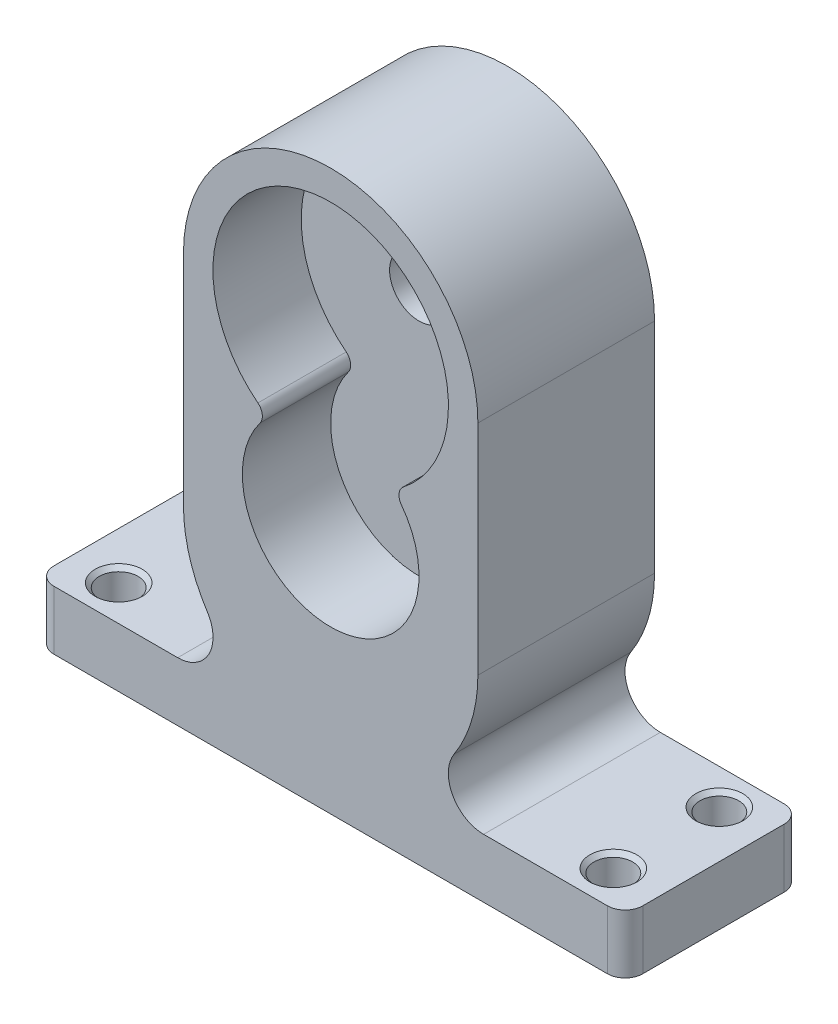
ISO-10303-21;
HEADER;
FILE_DESCRIPTION(('STEP AP214'),'2;1');
FILE_NAME('part.step','',(''),(''),'','','');
FILE_SCHEMA(('AUTOMOTIVE_DESIGN { 1 0 10303 214 1 1 1 1 }'));
ENDSEC;
DATA;
#1=APPLICATION_CONTEXT('core data for automotive mechanical design processes');
#2=APPLICATION_PROTOCOL_DEFINITION('international standard','automotive_design',2000,#1);
#3=PRODUCT_CONTEXT('',#1,'mechanical');
#4=PRODUCT('Part','Part','',(#3));
#5=PRODUCT_RELATED_PRODUCT_CATEGORY('part','',(#4));
#6=PRODUCT_DEFINITION_FORMATION('','',#4);
#7=PRODUCT_DEFINITION_CONTEXT('part definition',#1,'design');
#8=PRODUCT_DEFINITION('design','',#6,#7);
#9=PRODUCT_DEFINITION_SHAPE('','',#8);
#10=(LENGTH_UNIT() NAMED_UNIT(*) SI_UNIT(.MILLI.,.METRE.));
#11=(NAMED_UNIT(*) PLANE_ANGLE_UNIT() SI_UNIT($,.RADIAN.));
#12=(NAMED_UNIT(*) SI_UNIT($,.STERADIAN.) SOLID_ANGLE_UNIT());
#13=UNCERTAINTY_MEASURE_WITH_UNIT(LENGTH_MEASURE(1.E-05),#10,'distance_accuracy_value','');
#14=(GEOMETRIC_REPRESENTATION_CONTEXT(3) GLOBAL_UNCERTAINTY_ASSIGNED_CONTEXT((#13)) GLOBAL_UNIT_ASSIGNED_CONTEXT((#10,
#11,#12)) REPRESENTATION_CONTEXT('',''));
#15=CARTESIAN_POINT('',(0.,0.,0.));
#16=DIRECTION('',(0.,0.,1.));
#17=DIRECTION('',(1.,0.,0.));
#18=AXIS2_PLACEMENT_3D('',#15,#16,#17);
#19=CARTESIAN_POINT('',(0.,70.0001523668268,-30.));
#20=DIRECTION('',(0.,0.,1.));
#21=DIRECTION('',(1.,0.,0.));
#22=AXIS2_PLACEMENT_3D('',#19,#20,#21);
#23=CYLINDRICAL_SURFACE('',#22,25.);
#24=CARTESIAN_POINT('',(0.,70.0001523668268,0.));
#25=DIRECTION('',(0.,0.,1.));
#26=DIRECTION('',(-1.,0.,0.));
#27=AXIS2_PLACEMENT_3D('',#24,#25,#26);
#28=CIRCLE('',#27,25.);
#29=CARTESIAN_POINT('',(25.,70.0001523668268,0.));
#30=VERTEX_POINT('',#29);
#31=CARTESIAN_POINT('',(-25.,70.0001523668268,0.));
#32=VERTEX_POINT('',#31);
#33=EDGE_CURVE('E212',#30,#32,#28,.T.);
#34=ORIENTED_EDGE('',*,*,#33,.F.);
#35=DIRECTION('',(0.,0.,1.));
#36=VECTOR('',#35,1.);
#37=CARTESIAN_POINT('',(25.,70.0001523668268,-30.));
#38=LINE('',#37,#36);
#39=CARTESIAN_POINT('',(25.,70.0001523668268,-30.));
#40=VERTEX_POINT('',#39);
#41=EDGE_CURVE('E178',#40,#30,#38,.T.);
#42=ORIENTED_EDGE('',*,*,#41,.F.);
#43=CARTESIAN_POINT('',(0.,70.0001523668268,-30.));
#44=DIRECTION('',(0.,0.,1.));
#45=DIRECTION('',(-1.,0.,0.));
#46=AXIS2_PLACEMENT_3D('',#43,#44,#45);
#47=CIRCLE('',#46,25.);
#48=CARTESIAN_POINT('',(-25.,70.0001523668268,-30.));
#49=VERTEX_POINT('',#48);
#50=EDGE_CURVE('E173',#40,#49,#47,.T.);
#51=ORIENTED_EDGE('',*,*,#50,.T.);
#52=DIRECTION('',(0.,0.,1.));
#53=VECTOR('',#52,1.);
#54=CARTESIAN_POINT('',(-25.,70.0001523668268,-30.));
#55=LINE('',#54,#53);
#56=EDGE_CURVE('E177',#49,#32,#55,.T.);
#57=ORIENTED_EDGE('',*,*,#56,.T.);
#58=EDGE_LOOP('',(#34,#42,#51,#57));
#59=FACE_BOUND('',#58,.T.);
#60=ADVANCED_FACE('F37',(#59),#23,.T.);
#61=CARTESIAN_POINT('',(25.,70.0001523668268,-30.));
#62=DIRECTION('',(1.,0.,0.));
#63=DIRECTION('',(0.,1.,0.));
#64=AXIS2_PLACEMENT_3D('',#61,#62,#63);
#65=PLANE('',#64);
#66=DIRECTION('',(0.,1.,0.));
#67=VECTOR('',#66,1.);
#68=CARTESIAN_POINT('',(25.,70.0001523668268,0.));
#69=LINE('',#68,#67);
#70=CARTESIAN_POINT('',(25.,32.9128784747792,0.));
#71=VERTEX_POINT('',#70);
#72=EDGE_CURVE('E225',#71,#30,#69,.T.);
#73=ORIENTED_EDGE('',*,*,#72,.F.);
#74=DIRECTION('',(0.,0.,1.));
#75=VECTOR('',#74,1.);
#76=CARTESIAN_POINT('',(25.,32.9128784747792,-30.));
#77=LINE('',#76,#75);
#78=CARTESIAN_POINT('',(25.,32.9128784747792,-30.));
#79=VERTEX_POINT('',#78);
#80=EDGE_CURVE('E231',#79,#71,#77,.T.);
#81=ORIENTED_EDGE('',*,*,#80,.F.);
#82=DIRECTION('',(0.,1.,0.));
#83=VECTOR('',#82,1.);
#84=CARTESIAN_POINT('',(25.,70.0001523668268,-30.));
#85=LINE('',#84,#83);
#86=EDGE_CURVE('E183',#79,#40,#85,.T.);
#87=ORIENTED_EDGE('',*,*,#86,.T.);
#88=ORIENTED_EDGE('',*,*,#41,.T.);
#89=EDGE_LOOP('',(#73,#81,#87,#88));
#90=FACE_BOUND('',#89,.T.);
#91=ADVANCED_FACE('F424',(#90),#65,.T.);
#92=CARTESIAN_POINT('',(0.,32.9128784747792,-30.));
#93=DIRECTION('',(0.,0.,1.));
#94=DIRECTION('',(1.,0.,0.));
#95=AXIS2_PLACEMENT_3D('',#92,#93,#94);
#96=CYLINDRICAL_SURFACE('',#95,25.);
#97=CARTESIAN_POINT('',(0.,32.9128784747792,0.));
#98=DIRECTION('',(0.,0.,1.));
#99=DIRECTION('',(1.,0.,0.));
#100=AXIS2_PLACEMENT_3D('',#97,#98,#99);
#101=CIRCLE('',#100,25.);
#102=CARTESIAN_POINT('',(20.951521978517,19.2734603499573,0.));
#103=VERTEX_POINT('',#102);
#104=EDGE_CURVE('E223',#103,#71,#101,.T.);
#105=ORIENTED_EDGE('',*,*,#104,.F.);
#106=DIRECTION('',(0.,0.,1.));
#107=VECTOR('',#106,1.);
#108=CARTESIAN_POINT('',(20.9515219785169,19.2734603499573,-30.));
#109=LINE('',#108,#107);
#110=CARTESIAN_POINT('',(20.951521978517,19.2734603499573,-30.));
#111=VERTEX_POINT('',#110);
#112=EDGE_CURVE('E246',#103,#111,#109,.F.);
#113=ORIENTED_EDGE('',*,*,#112,.T.);
#114=CARTESIAN_POINT('',(0.,32.9128784747792,-30.));
#115=DIRECTION('',(0.,0.,1.));
#116=DIRECTION('',(1.,0.,0.));
#117=AXIS2_PLACEMENT_3D('',#114,#115,#116);
#118=CIRCLE('',#117,25.);
#119=EDGE_CURVE('E214',#111,#79,#118,.T.);
#120=ORIENTED_EDGE('',*,*,#119,.T.);
#121=ORIENTED_EDGE('',*,*,#80,.T.);
#122=EDGE_LOOP('',(#105,#113,#120,#121));
#123=FACE_BOUND('',#122,.T.);
#124=ADVANCED_FACE('F429',(#123),#96,.T.);
#125=CARTESIAN_POINT('',(50.,10.,-30.));
#126=DIRECTION('',(0.,1.,0.));
#127=DIRECTION('',(-1.,0.,0.));
#128=AXIS2_PLACEMENT_3D('',#125,#126,#127);
#129=PLANE('',#128);
#130=CARTESIAN_POINT('',(42.,10.,-6.));
#131=DIRECTION('',(0.,1.,0.));
#132=DIRECTION('',(0.,0.,1.));
#133=AXIS2_PLACEMENT_3D('',#130,#131,#132);
#134=CIRCLE('',#133,4.);
#135=CARTESIAN_POINT('',(42.,10.,-2.00000000000001));
#136=VERTEX_POINT('',#135);
#137=EDGE_CURVE('E385',#136,#136,#134,.T.);
#138=ORIENTED_EDGE('',*,*,#137,.F.);
#139=EDGE_LOOP('',(#138));
#140=FACE_BOUND('',#139,.T.);
#141=CARTESIAN_POINT('',(42.,10.,-24.));
#142=DIRECTION('',(0.,1.,0.));
#143=DIRECTION('',(0.,0.,1.));
#144=AXIS2_PLACEMENT_3D('',#141,#142,#143);
#145=CIRCLE('',#144,4.);
#146=CARTESIAN_POINT('',(42.,10.,-20.));
#147=VERTEX_POINT('',#146);
#148=EDGE_CURVE('E367',#147,#147,#145,.T.);
#149=ORIENTED_EDGE('',*,*,#148,.F.);
#150=EDGE_LOOP('',(#149));
#151=FACE_BOUND('',#150,.T.);
#152=DIRECTION('',(0.,0.,1.));
#153=VECTOR('',#152,1.);
#154=CARTESIAN_POINT('',(50.,10.,-30.));
#155=LINE('',#154,#153);
#156=CARTESIAN_POINT('',(50.,10.,-27.));
#157=VERTEX_POINT('',#156);
#158=CARTESIAN_POINT('',(50.,10.,-3.));
#159=VERTEX_POINT('',#158);
#160=EDGE_CURVE('E234',#157,#159,#155,.T.);
#161=ORIENTED_EDGE('',*,*,#160,.F.);
#162=CARTESIAN_POINT('',(47.,10.,-27.));
#163=DIRECTION('',(0.,1.,0.));
#164=DIRECTION('',(-1.,0.,0.));
#165=AXIS2_PLACEMENT_3D('',#162,#163,#164);
#166=CIRCLE('',#165,3.);
#167=CARTESIAN_POINT('',(47.,10.,-30.));
#168=VERTEX_POINT('',#167);
#169=EDGE_CURVE('E11',#157,#168,#166,.T.);
#170=ORIENTED_EDGE('',*,*,#169,.T.);
#171=DIRECTION('',(-1.,0.,0.));
#172=VECTOR('',#171,1.);
#173=CARTESIAN_POINT('',(50.,10.,-30.));
#174=LINE('',#173,#172);
#175=CARTESIAN_POINT('',(25.979887253361,10.,-30.));
#176=VERTEX_POINT('',#175);
#177=EDGE_CURVE('E211',#168,#176,#174,.T.);
#178=ORIENTED_EDGE('',*,*,#177,.T.);
#179=DIRECTION('',(0.,0.,-1.));
#180=VECTOR('',#179,1.);
#181=CARTESIAN_POINT('',(25.979887253361,10.,0.));
#182=LINE('',#181,#180);
#183=CARTESIAN_POINT('',(25.979887253361,10.,0.));
#184=VERTEX_POINT('',#183);
#185=EDGE_CURVE('E243',#176,#184,#182,.F.);
#186=ORIENTED_EDGE('',*,*,#185,.T.);
#187=DIRECTION('',(-1.,0.,0.));
#188=VECTOR('',#187,1.);
#189=CARTESIAN_POINT('',(50.,10.,0.));
#190=LINE('',#189,#188);
#191=CARTESIAN_POINT('',(47.,10.,0.));
#192=VERTEX_POINT('',#191);
#193=EDGE_CURVE('E220',#192,#184,#190,.T.);
#194=ORIENTED_EDGE('',*,*,#193,.F.);
#195=CARTESIAN_POINT('',(47.,10.,-3.));
#196=DIRECTION('',(0.,1.,0.));
#197=DIRECTION('',(-1.,0.,0.));
#198=AXIS2_PLACEMENT_3D('',#195,#196,#197);
#199=CIRCLE('',#198,3.);
#200=EDGE_CURVE('E45',#192,#159,#199,.T.);
#201=ORIENTED_EDGE('',*,*,#200,.T.);
#202=EDGE_LOOP('',(#161,#170,#178,#186,#194,#201));
#203=FACE_BOUND('',#202,.T.);
#204=ADVANCED_FACE('F311',(#140,#151,#203),#129,.T.);
#205=CARTESIAN_POINT('',(50.,0.,-30.));
#206=DIRECTION('',(1.,0.,0.));
#207=DIRECTION('',(0.,0.,-1.));
#208=AXIS2_PLACEMENT_3D('',#205,#206,#207);
#209=PLANE('',#208);
#210=DIRECTION('',(0.,0.,1.));
#211=VECTOR('',#210,1.);
#212=CARTESIAN_POINT('',(50.,0.,-30.));
#213=LINE('',#212,#211);
#214=CARTESIAN_POINT('',(50.,0.,-27.));
#215=VERTEX_POINT('',#214);
#216=CARTESIAN_POINT('',(50.,0.,-3.));
#217=VERTEX_POINT('',#216);
#218=EDGE_CURVE('E182',#215,#217,#213,.T.);
#219=ORIENTED_EDGE('',*,*,#218,.F.);
#220=DIRECTION('',(0.,1.,0.));
#221=VECTOR('',#220,1.);
#222=CARTESIAN_POINT('',(50.,10.,-27.));
#223=LINE('',#222,#221);
#224=EDGE_CURVE('E305',#215,#157,#223,.T.);
#225=ORIENTED_EDGE('',*,*,#224,.T.);
#226=ORIENTED_EDGE('',*,*,#160,.T.);
#227=DIRECTION('',(0.,1.,0.));
#228=VECTOR('',#227,1.);
#229=CARTESIAN_POINT('',(50.,0.,-3.));
#230=LINE('',#229,#228);
#231=EDGE_CURVE('E303',#159,#217,#230,.F.);
#232=ORIENTED_EDGE('',*,*,#231,.T.);
#233=EDGE_LOOP('',(#219,#225,#226,#232));
#234=FACE_BOUND('',#233,.T.);
#235=ADVANCED_FACE('F308',(#234),#209,.T.);
#236=CARTESIAN_POINT('',(0.,0.,-30.));
#237=DIRECTION('',(0.,-1.,0.));
#238=DIRECTION('',(0.,0.,-1.));
#239=AXIS2_PLACEMENT_3D('',#236,#237,#238);
#240=PLANE('',#239);
#241=CARTESIAN_POINT('',(-42.,0.,-6.));
#242=DIRECTION('',(0.,1.,0.));
#243=DIRECTION('',(0.,0.,1.));
#244=AXIS2_PLACEMENT_3D('',#241,#242,#243);
#245=CIRCLE('',#244,3.29999999999998);
#246=CARTESIAN_POINT('',(-42.,0.,-2.70000000000002));
#247=VERTEX_POINT('',#246);
#248=EDGE_CURVE('E388',#247,#247,#245,.T.);
#249=ORIENTED_EDGE('',*,*,#248,.T.);
#250=EDGE_LOOP('',(#249));
#251=FACE_BOUND('',#250,.T.);
#252=CARTESIAN_POINT('',(42.,0.,-6.));
#253=DIRECTION('',(0.,1.,0.));
#254=DIRECTION('',(0.,0.,1.));
#255=AXIS2_PLACEMENT_3D('',#252,#253,#254);
#256=CIRCLE('',#255,3.29999999999998);
#257=CARTESIAN_POINT('',(42.,0.,-2.70000000000002));
#258=VERTEX_POINT('',#257);
#259=EDGE_CURVE('E379',#258,#258,#256,.T.);
#260=ORIENTED_EDGE('',*,*,#259,.T.);
#261=EDGE_LOOP('',(#260));
#262=FACE_BOUND('',#261,.T.);
#263=CARTESIAN_POINT('',(-42.,0.,-24.));
#264=DIRECTION('',(0.,1.,0.));
#265=DIRECTION('',(0.,0.,1.));
#266=AXIS2_PLACEMENT_3D('',#263,#264,#265);
#267=CIRCLE('',#266,3.29999999999998);
#268=CARTESIAN_POINT('',(-42.,0.,-20.7));
#269=VERTEX_POINT('',#268);
#270=EDGE_CURVE('E370',#269,#269,#267,.T.);
#271=ORIENTED_EDGE('',*,*,#270,.T.);
#272=EDGE_LOOP('',(#271));
#273=FACE_BOUND('',#272,.T.);
#274=CARTESIAN_POINT('',(42.,0.,-24.));
#275=DIRECTION('',(0.,1.,0.));
#276=DIRECTION('',(0.,0.,1.));
#277=AXIS2_PLACEMENT_3D('',#274,#275,#276);
#278=CIRCLE('',#277,3.3);
#279=CARTESIAN_POINT('',(42.,0.,-20.7));
#280=VERTEX_POINT('',#279);
#281=EDGE_CURVE('E359',#280,#280,#278,.T.);
#282=ORIENTED_EDGE('',*,*,#281,.T.);
#283=EDGE_LOOP('',(#282));
#284=FACE_BOUND('',#283,.T.);
#285=DIRECTION('',(1.,0.,0.));
#286=VECTOR('',#285,1.);
#287=CARTESIAN_POINT('',(0.,0.,0.));
#288=LINE('',#287,#286);
#289=CARTESIAN_POINT('',(-47.,0.,0.));
#290=VERTEX_POINT('',#289);
#291=CARTESIAN_POINT('',(47.,0.,0.));
#292=VERTEX_POINT('',#291);
#293=EDGE_CURVE('E217',#290,#292,#288,.T.);
#294=ORIENTED_EDGE('',*,*,#293,.F.);
#295=CARTESIAN_POINT('',(-47.,0.,-3.));
#296=DIRECTION('',(0.,-1.,0.));
#297=DIRECTION('',(0.,0.,-1.));
#298=AXIS2_PLACEMENT_3D('',#295,#296,#297);
#299=CIRCLE('',#298,3.);
#300=CARTESIAN_POINT('',(-50.,0.,-3.));
#301=VERTEX_POINT('',#300);
#302=EDGE_CURVE('E296',#290,#301,#299,.T.);
#303=ORIENTED_EDGE('',*,*,#302,.T.);
#304=DIRECTION('',(0.,0.,1.));
#305=VECTOR('',#304,1.);
#306=CARTESIAN_POINT('',(-50.,0.,-30.));
#307=LINE('',#306,#305);
#308=CARTESIAN_POINT('',(-50.,0.,-27.));
#309=VERTEX_POINT('',#308);
#310=EDGE_CURVE('E221',#309,#301,#307,.T.);
#311=ORIENTED_EDGE('',*,*,#310,.F.);
#312=CARTESIAN_POINT('',(-47.,0.,-27.));
#313=DIRECTION('',(0.,-1.,0.));
#314=DIRECTION('',(0.,0.,-1.));
#315=AXIS2_PLACEMENT_3D('',#312,#313,#314);
#316=CIRCLE('',#315,3.);
#317=CARTESIAN_POINT('',(-47.,0.,-30.));
#318=VERTEX_POINT('',#317);
#319=EDGE_CURVE('E294',#309,#318,#316,.T.);
#320=ORIENTED_EDGE('',*,*,#319,.T.);
#321=DIRECTION('',(1.,0.,0.));
#322=VECTOR('',#321,1.);
#323=CARTESIAN_POINT('',(0.,0.,-30.));
#324=LINE('',#323,#322);
#325=CARTESIAN_POINT('',(47.,0.,-30.));
#326=VERTEX_POINT('',#325);
#327=EDGE_CURVE('E208',#318,#326,#324,.T.);
#328=ORIENTED_EDGE('',*,*,#327,.T.);
#329=CARTESIAN_POINT('',(47.,0.,-27.));
#330=DIRECTION('',(0.,-1.,0.));
#331=DIRECTION('',(0.,0.,-1.));
#332=AXIS2_PLACEMENT_3D('',#329,#330,#331);
#333=CIRCLE('',#332,3.);
#334=EDGE_CURVE('E292',#326,#215,#333,.T.);
#335=ORIENTED_EDGE('',*,*,#334,.T.);
#336=ORIENTED_EDGE('',*,*,#218,.T.);
#337=CARTESIAN_POINT('',(47.,0.,-3.));
#338=DIRECTION('',(0.,-1.,0.));
#339=DIRECTION('',(0.,0.,-1.));
#340=AXIS2_PLACEMENT_3D('',#337,#338,#339);
#341=CIRCLE('',#340,3.);
#342=EDGE_CURVE('E290',#217,#292,#341,.T.);
#343=ORIENTED_EDGE('',*,*,#342,.T.);
#344=EDGE_LOOP('',(#294,#303,#311,#320,#328,#335,#336,#343));
#345=FACE_BOUND('',#344,.T.);
#346=ADVANCED_FACE('F319',(#251,#262,#273,#284,#345),#240,.T.);
#347=CARTESIAN_POINT('',(0.,32.9128784747792,-30.));
#348=DIRECTION('',(0.,0.,1.));
#349=DIRECTION('',(1.,0.,0.));
#350=AXIS2_PLACEMENT_3D('',#347,#348,#349);
#351=PLANE('',#350);
#352=CARTESIAN_POINT('',(0.,70.0001523668268,-30.));
#353=DIRECTION('',(0.,0.,1.));
#354=DIRECTION('',(1.,0.,0.));
#355=AXIS2_PLACEMENT_3D('',#352,#353,#354);
#356=CIRCLE('',#355,5.);
#357=CARTESIAN_POINT('',(5.,70.0001523668268,-30.));
#358=VERTEX_POINT('',#357);
#359=EDGE_CURVE('E347',#358,#358,#356,.T.);
#360=ORIENTED_EDGE('',*,*,#359,.T.);
#361=EDGE_LOOP('',(#360));
#362=FACE_BOUND('',#361,.T.);
#363=ORIENTED_EDGE('',*,*,#327,.F.);
#364=DIRECTION('',(0.,1.,0.));
#365=VECTOR('',#364,1.);
#366=CARTESIAN_POINT('',(-47.,32.9128784747792,-30.));
#367=LINE('',#366,#365);
#368=CARTESIAN_POINT('',(-47.,9.99999999999999,-30.));
#369=VERTEX_POINT('',#368);
#370=EDGE_CURVE('E300',#318,#369,#367,.T.);
#371=ORIENTED_EDGE('',*,*,#370,.T.);
#372=DIRECTION('',(1.,0.,0.));
#373=VECTOR('',#372,1.);
#374=CARTESIAN_POINT('',(-50.,9.99999999999999,-30.));
#375=LINE('',#374,#373);
#376=CARTESIAN_POINT('',(-25.979887253361,9.99999999999999,-30.));
#377=VERTEX_POINT('',#376);
#378=EDGE_CURVE('E201',#369,#377,#375,.T.);
#379=ORIENTED_EDGE('',*,*,#378,.T.);
#380=CARTESIAN_POINT('',(-25.979887253361,16.,-30.));
#381=DIRECTION('',(0.,0.,1.));
#382=DIRECTION('',(1.,0.,0.));
#383=AXIS2_PLACEMENT_3D('',#380,#381,#382);
#384=CIRCLE('',#383,6.);
#385=CARTESIAN_POINT('',(-20.951521978517,19.2734603499573,-30.));
#386=VERTEX_POINT('',#385);
#387=EDGE_CURVE('E251',#377,#386,#384,.T.);
#388=ORIENTED_EDGE('',*,*,#387,.T.);
#389=CARTESIAN_POINT('',(0.,32.9128784747792,-30.));
#390=DIRECTION('',(0.,0.,-1.));
#391=DIRECTION('',(-1.,0.,0.));
#392=AXIS2_PLACEMENT_3D('',#389,#390,#391);
#393=CIRCLE('',#392,25.);
#394=CARTESIAN_POINT('',(-25.,32.9128784747792,-30.));
#395=VERTEX_POINT('',#394);
#396=EDGE_CURVE('E190',#386,#395,#393,.T.);
#397=ORIENTED_EDGE('',*,*,#396,.T.);
#398=DIRECTION('',(0.,1.,0.));
#399=VECTOR('',#398,1.);
#400=CARTESIAN_POINT('',(-25.,70.0001523668268,-30.));
#401=LINE('',#400,#399);
#402=EDGE_CURVE('E186',#395,#49,#401,.T.);
#403=ORIENTED_EDGE('',*,*,#402,.T.);
#404=ORIENTED_EDGE('',*,*,#50,.F.);
#405=ORIENTED_EDGE('',*,*,#86,.F.);
#406=ORIENTED_EDGE('',*,*,#119,.F.);
#407=CARTESIAN_POINT('',(25.979887253361,16.,-30.));
#408=DIRECTION('',(0.,0.,1.));
#409=DIRECTION('',(1.,0.,0.));
#410=AXIS2_PLACEMENT_3D('',#407,#408,#409);
#411=CIRCLE('',#410,6.);
#412=EDGE_CURVE('E255',#111,#176,#411,.T.);
#413=ORIENTED_EDGE('',*,*,#412,.T.);
#414=ORIENTED_EDGE('',*,*,#177,.F.);
#415=DIRECTION('',(0.,1.,0.));
#416=VECTOR('',#415,1.);
#417=CARTESIAN_POINT('',(47.,0.,-30.));
#418=LINE('',#417,#416);
#419=EDGE_CURVE('E298',#168,#326,#418,.F.);
#420=ORIENTED_EDGE('',*,*,#419,.T.);
#421=EDGE_LOOP('',(#363,#371,#379,#388,#397,#403,#404,#405,#406,#413,#414,#420));
#422=FACE_BOUND('',#421,.T.);
#423=ADVANCED_FACE('F188',(#362,#422),#351,.F.);
#424=CARTESIAN_POINT('',(0.,32.9128784747792,0.));
#425=DIRECTION('',(0.,0.,1.));
#426=DIRECTION('',(1.,0.,0.));
#427=AXIS2_PLACEMENT_3D('',#424,#425,#426);
#428=PLANE('',#427);
#429=CARTESIAN_POINT('',(0.,70.0001523668268,0.));
#430=DIRECTION('',(0.,0.,1.));
#431=DIRECTION('',(1.,0.,0.));
#432=AXIS2_PLACEMENT_3D('',#429,#430,#431);
#433=CIRCLE('',#432,20.);
#434=CARTESIAN_POINT('',(12.3604707280516,54.2769604713821,0.));
#435=VERTEX_POINT('',#434);
#436=CARTESIAN_POINT('',(-12.3604707280516,54.2769604713821,0.));
#437=VERTEX_POINT('',#436);
#438=EDGE_CURVE('E344',#435,#437,#433,.T.);
#439=ORIENTED_EDGE('',*,*,#438,.F.);
#440=CARTESIAN_POINT('',(13.5965178008568,52.7046412818376,0.));
#441=DIRECTION('',(0.,0.,1.));
#442=DIRECTION('',(1.,0.,0.));
#443=AXIS2_PLACEMENT_3D('',#440,#441,#442);
#444=CIRCLE('',#443,2.);
#445=CARTESIAN_POINT('',(11.9969274713442,51.5040952486802,0.));
#446=VERTEX_POINT('',#445);
#447=EDGE_CURVE('E266',#435,#446,#444,.T.);
#448=ORIENTED_EDGE('',*,*,#447,.T.);
#449=CARTESIAN_POINT('',(0.,42.5,0.));
#450=DIRECTION('',(0.,0.,1.));
#451=DIRECTION('',(1.,0.,0.));
#452=AXIS2_PLACEMENT_3D('',#449,#450,#451);
#453=CIRCLE('',#452,15.);
#454=CARTESIAN_POINT('',(-11.9969274713442,51.5040952486802,0.));
#455=VERTEX_POINT('',#454);
#456=EDGE_CURVE('E356',#455,#446,#453,.T.);
#457=ORIENTED_EDGE('',*,*,#456,.F.);
#458=CARTESIAN_POINT('',(-13.5965178008568,52.7046412818376,0.));
#459=DIRECTION('',(0.,0.,1.));
#460=DIRECTION('',(1.,0.,0.));
#461=AXIS2_PLACEMENT_3D('',#458,#459,#460);
#462=CIRCLE('',#461,2.);
#463=EDGE_CURVE('E264',#455,#437,#462,.T.);
#464=ORIENTED_EDGE('',*,*,#463,.T.);
#465=EDGE_LOOP('',(#439,#448,#457,#464));
#466=FACE_BOUND('',#465,.T.);
#467=DIRECTION('',(1.,0.,0.));
#468=VECTOR('',#467,1.);
#469=CARTESIAN_POINT('',(-50.,9.99999999999999,0.));
#470=LINE('',#469,#468);
#471=CARTESIAN_POINT('',(-47.,9.99999999999999,0.));
#472=VERTEX_POINT('',#471);
#473=CARTESIAN_POINT('',(-25.979887253361,9.99999999999999,0.));
#474=VERTEX_POINT('',#473);
#475=EDGE_CURVE('E194',#472,#474,#470,.T.);
#476=ORIENTED_EDGE('',*,*,#475,.F.);
#477=DIRECTION('',(0.,1.,0.));
#478=VECTOR('',#477,1.);
#479=CARTESIAN_POINT('',(-47.,0.,0.));
#480=LINE('',#479,#478);
#481=EDGE_CURVE('E288',#472,#290,#480,.F.);
#482=ORIENTED_EDGE('',*,*,#481,.T.);
#483=ORIENTED_EDGE('',*,*,#293,.T.);
#484=DIRECTION('',(0.,1.,0.));
#485=VECTOR('',#484,1.);
#486=CARTESIAN_POINT('',(47.,32.9128784747792,0.));
#487=LINE('',#486,#485);
#488=EDGE_CURVE('E285',#292,#192,#487,.T.);
#489=ORIENTED_EDGE('',*,*,#488,.T.);
#490=ORIENTED_EDGE('',*,*,#193,.T.);
#491=CARTESIAN_POINT('',(25.979887253361,16.,0.));
#492=DIRECTION('',(0.,0.,1.));
#493=DIRECTION('',(1.,0.,0.));
#494=AXIS2_PLACEMENT_3D('',#491,#492,#493);
#495=CIRCLE('',#494,6.);
#496=EDGE_CURVE('E253',#184,#103,#495,.F.);
#497=ORIENTED_EDGE('',*,*,#496,.T.);
#498=ORIENTED_EDGE('',*,*,#104,.T.);
#499=ORIENTED_EDGE('',*,*,#72,.T.);
#500=ORIENTED_EDGE('',*,*,#33,.T.);
#501=DIRECTION('',(0.,1.,0.));
#502=VECTOR('',#501,1.);
#503=CARTESIAN_POINT('',(-25.,70.0001523668268,0.));
#504=LINE('',#503,#502);
#505=CARTESIAN_POINT('',(-25.,32.9128784747792,0.));
#506=VERTEX_POINT('',#505);
#507=EDGE_CURVE('E199',#506,#32,#504,.T.);
#508=ORIENTED_EDGE('',*,*,#507,.F.);
#509=CARTESIAN_POINT('',(0.,32.9128784747792,0.));
#510=DIRECTION('',(0.,0.,-1.));
#511=DIRECTION('',(-1.,0.,0.));
#512=AXIS2_PLACEMENT_3D('',#509,#510,#511);
#513=CIRCLE('',#512,25.);
#514=CARTESIAN_POINT('',(-20.951521978517,19.2734603499573,0.));
#515=VERTEX_POINT('',#514);
#516=EDGE_CURVE('E339',#515,#506,#513,.T.);
#517=ORIENTED_EDGE('',*,*,#516,.F.);
#518=CARTESIAN_POINT('',(-25.979887253361,16.,0.));
#519=DIRECTION('',(0.,0.,1.));
#520=DIRECTION('',(1.,0.,0.));
#521=AXIS2_PLACEMENT_3D('',#518,#519,#520);
#522=CIRCLE('',#521,6.);
#523=EDGE_CURVE('E248',#515,#474,#522,.F.);
#524=ORIENTED_EDGE('',*,*,#523,.T.);
#525=EDGE_LOOP('',(#476,#482,#483,#489,#490,#497,#498,#499,#500,#508,#517,#524));
#526=FACE_BOUND('',#525,.T.);
#527=ADVANCED_FACE('F433',(#466,#526),#428,.T.);
#528=CARTESIAN_POINT('',(-50.,0.,-30.));
#529=DIRECTION('',(1.,0.,0.));
#530=DIRECTION('',(0.,1.,0.));
#531=AXIS2_PLACEMENT_3D('',#528,#529,#530);
#532=PLANE('',#531);
#533=ORIENTED_EDGE('',*,*,#310,.T.);
#534=DIRECTION('',(0.,1.,0.));
#535=VECTOR('',#534,1.);
#536=CARTESIAN_POINT('',(-50.,9.99999999999999,-3.));
#537=LINE('',#536,#535);
#538=CARTESIAN_POINT('',(-50.,9.99999999999999,-3.));
#539=VERTEX_POINT('',#538);
#540=EDGE_CURVE('E278',#301,#539,#537,.T.);
#541=ORIENTED_EDGE('',*,*,#540,.T.);
#542=DIRECTION('',(0.,0.,1.));
#543=VECTOR('',#542,1.);
#544=CARTESIAN_POINT('',(-50.,9.99999999999999,-30.));
#545=LINE('',#544,#543);
#546=CARTESIAN_POINT('',(-50.,9.99999999999999,-27.));
#547=VERTEX_POINT('',#546);
#548=EDGE_CURVE('E203',#547,#539,#545,.T.);
#549=ORIENTED_EDGE('',*,*,#548,.F.);
#550=DIRECTION('',(0.,1.,0.));
#551=VECTOR('',#550,1.);
#552=CARTESIAN_POINT('',(-50.,0.,-27.));
#553=LINE('',#552,#551);
#554=EDGE_CURVE('E276',#547,#309,#553,.F.);
#555=ORIENTED_EDGE('',*,*,#554,.T.);
#556=EDGE_LOOP('',(#533,#541,#549,#555));
#557=FACE_BOUND('',#556,.T.);
#558=ADVANCED_FACE('F334',(#557),#532,.F.);
#559=CARTESIAN_POINT('',(-50.,9.99999999999999,-30.));
#560=DIRECTION('',(0.,-1.,0.));
#561=DIRECTION('',(1.,0.,0.));
#562=AXIS2_PLACEMENT_3D('',#559,#560,#561);
#563=PLANE('',#562);
#564=CARTESIAN_POINT('',(-42.,9.99999999999999,-6.));
#565=DIRECTION('',(0.,1.,0.));
#566=DIRECTION('',(0.,0.,1.));
#567=AXIS2_PLACEMENT_3D('',#564,#565,#566);
#568=CIRCLE('',#567,4.);
#569=CARTESIAN_POINT('',(-42.,9.99999999999999,-2.00000000000001));
#570=VERTEX_POINT('',#569);
#571=EDGE_CURVE('E394',#570,#570,#568,.T.);
#572=ORIENTED_EDGE('',*,*,#571,.F.);
#573=EDGE_LOOP('',(#572));
#574=FACE_BOUND('',#573,.T.);
#575=CARTESIAN_POINT('',(-42.,9.99999999999999,-24.));
#576=DIRECTION('',(0.,1.,0.));
#577=DIRECTION('',(0.,0.,1.));
#578=AXIS2_PLACEMENT_3D('',#575,#576,#577);
#579=CIRCLE('',#578,4.);
#580=CARTESIAN_POINT('',(-42.,9.99999999999999,-20.));
#581=VERTEX_POINT('',#580);
#582=EDGE_CURVE('E376',#581,#581,#579,.T.);
#583=ORIENTED_EDGE('',*,*,#582,.F.);
#584=EDGE_LOOP('',(#583));
#585=FACE_BOUND('',#584,.T.);
#586=ORIENTED_EDGE('',*,*,#548,.T.);
#587=CARTESIAN_POINT('',(-47.,9.99999999999999,-3.));
#588=DIRECTION('',(0.,-1.,0.));
#589=DIRECTION('',(1.,0.,0.));
#590=AXIS2_PLACEMENT_3D('',#587,#588,#589);
#591=CIRCLE('',#590,3.);
#592=EDGE_CURVE('E283',#539,#472,#591,.F.);
#593=ORIENTED_EDGE('',*,*,#592,.T.);
#594=ORIENTED_EDGE('',*,*,#475,.T.);
#595=DIRECTION('',(0.,0.,-1.));
#596=VECTOR('',#595,1.);
#597=CARTESIAN_POINT('',(-25.979887253361,9.99999999999999,-30.));
#598=LINE('',#597,#596);
#599=EDGE_CURVE('E240',#474,#377,#598,.T.);
#600=ORIENTED_EDGE('',*,*,#599,.T.);
#601=ORIENTED_EDGE('',*,*,#378,.F.);
#602=CARTESIAN_POINT('',(-47.,9.99999999999999,-27.));
#603=DIRECTION('',(0.,-1.,0.));
#604=DIRECTION('',(1.,0.,0.));
#605=AXIS2_PLACEMENT_3D('',#602,#603,#604);
#606=CIRCLE('',#605,3.);
#607=EDGE_CURVE('E281',#369,#547,#606,.F.);
#608=ORIENTED_EDGE('',*,*,#607,.T.);
#609=EDGE_LOOP('',(#586,#593,#594,#600,#601,#608));
#610=FACE_BOUND('',#609,.T.);
#611=ADVANCED_FACE('F331',(#574,#585,#610),#563,.F.);
#612=CARTESIAN_POINT('',(0.,32.9128784747792,-30.));
#613=DIRECTION('',(0.,0.,1.));
#614=DIRECTION('',(1.,0.,0.));
#615=AXIS2_PLACEMENT_3D('',#612,#613,#614);
#616=CYLINDRICAL_SURFACE('',#615,25.);
#617=ORIENTED_EDGE('',*,*,#396,.F.);
#618=DIRECTION('',(0.,0.,1.));
#619=VECTOR('',#618,1.);
#620=CARTESIAN_POINT('',(-20.951521978517,19.2734603499573,-30.));
#621=LINE('',#620,#619);
#622=EDGE_CURVE('E230',#386,#515,#621,.T.);
#623=ORIENTED_EDGE('',*,*,#622,.T.);
#624=ORIENTED_EDGE('',*,*,#516,.T.);
#625=DIRECTION('',(0.,0.,1.));
#626=VECTOR('',#625,1.);
#627=CARTESIAN_POINT('',(-25.,32.9128784747792,-30.));
#628=LINE('',#627,#626);
#629=EDGE_CURVE('E200',#395,#506,#628,.T.);
#630=ORIENTED_EDGE('',*,*,#629,.F.);
#631=EDGE_LOOP('',(#617,#623,#624,#630));
#632=FACE_BOUND('',#631,.T.);
#633=ADVANCED_FACE('F402',(#632),#616,.T.);
#634=CARTESIAN_POINT('',(-25.,70.0001523668268,-30.));
#635=DIRECTION('',(1.,0.,0.));
#636=DIRECTION('',(0.,1.,0.));
#637=AXIS2_PLACEMENT_3D('',#634,#635,#636);
#638=PLANE('',#637);
#639=ORIENTED_EDGE('',*,*,#507,.T.);
#640=ORIENTED_EDGE('',*,*,#56,.F.);
#641=ORIENTED_EDGE('',*,*,#402,.F.);
#642=ORIENTED_EDGE('',*,*,#629,.T.);
#643=EDGE_LOOP('',(#639,#640,#641,#642));
#644=FACE_BOUND('',#643,.T.);
#645=ADVANCED_FACE('F197',(#644),#638,.F.);
#646=CARTESIAN_POINT('',(0.,70.0001523668268,-15.));
#647=DIRECTION('',(0.,0.,1.));
#648=DIRECTION('',(1.,0.,0.));
#649=AXIS2_PLACEMENT_3D('',#646,#647,#648);
#650=CYLINDRICAL_SURFACE('',#649,20.);
#651=CARTESIAN_POINT('',(0.,70.0001523668268,-15.));
#652=DIRECTION('',(0.,0.,1.));
#653=DIRECTION('',(1.,0.,0.));
#654=AXIS2_PLACEMENT_3D('',#651,#652,#653);
#655=CIRCLE('',#654,20.);
#656=CARTESIAN_POINT('',(12.3604707280516,54.2769604713821,-15.));
#657=VERTEX_POINT('',#656);
#658=CARTESIAN_POINT('',(-12.3604707280516,54.2769604713821,-15.));
#659=VERTEX_POINT('',#658);
#660=EDGE_CURVE('E341',#657,#659,#655,.T.);
#661=ORIENTED_EDGE('',*,*,#660,.F.);
#662=DIRECTION('',(0.,0.,1.));
#663=VECTOR('',#662,1.);
#664=CARTESIAN_POINT('',(12.3604707280516,54.2769604713821,-15.));
#665=LINE('',#664,#663);
#666=EDGE_CURVE('E261',#657,#435,#665,.T.);
#667=ORIENTED_EDGE('',*,*,#666,.T.);
#668=ORIENTED_EDGE('',*,*,#438,.T.);
#669=DIRECTION('',(0.,0.,1.));
#670=VECTOR('',#669,1.);
#671=CARTESIAN_POINT('',(-12.3604707280516,54.2769604713821,-15.));
#672=LINE('',#671,#670);
#673=EDGE_CURVE('E258',#437,#659,#672,.F.);
#674=ORIENTED_EDGE('',*,*,#673,.T.);
#675=EDGE_LOOP('',(#661,#667,#668,#674));
#676=FACE_BOUND('',#675,.T.);
#677=ADVANCED_FACE('F498',(#676),#650,.F.);
#678=CARTESIAN_POINT('',(0.,70.0001523668268,-15.));
#679=DIRECTION('',(0.,0.,1.));
#680=DIRECTION('',(1.,0.,0.));
#681=AXIS2_PLACEMENT_3D('',#678,#679,#680);
#682=PLANE('',#681);
#683=CARTESIAN_POINT('',(0.,42.5,-15.));
#684=DIRECTION('',(0.,0.,1.));
#685=DIRECTION('',(1.,0.,0.));
#686=AXIS2_PLACEMENT_3D('',#683,#684,#685);
#687=CIRCLE('',#686,15.);
#688=CARTESIAN_POINT('',(-11.9969274713442,51.5040952486802,-15.));
#689=VERTEX_POINT('',#688);
#690=CARTESIAN_POINT('',(11.9969274713442,51.5040952486802,-15.));
#691=VERTEX_POINT('',#690);
#692=EDGE_CURVE('E353',#689,#691,#687,.T.);
#693=ORIENTED_EDGE('',*,*,#692,.T.);
#694=CARTESIAN_POINT('',(13.5965178008568,52.7046412818376,-15.));
#695=DIRECTION('',(0.,0.,1.));
#696=DIRECTION('',(1.,0.,0.));
#697=AXIS2_PLACEMENT_3D('',#694,#695,#696);
#698=CIRCLE('',#697,2.);
#699=EDGE_CURVE('E272',#691,#657,#698,.F.);
#700=ORIENTED_EDGE('',*,*,#699,.T.);
#701=ORIENTED_EDGE('',*,*,#660,.T.);
#702=CARTESIAN_POINT('',(-13.5965178008568,52.7046412818376,-15.));
#703=DIRECTION('',(0.,0.,1.));
#704=DIRECTION('',(1.,0.,0.));
#705=AXIS2_PLACEMENT_3D('',#702,#703,#704);
#706=CIRCLE('',#705,2.);
#707=EDGE_CURVE('E274',#659,#689,#706,.F.);
#708=ORIENTED_EDGE('',*,*,#707,.T.);
#709=EDGE_LOOP('',(#693,#700,#701,#708));
#710=FACE_BOUND('',#709,.T.);
#711=CARTESIAN_POINT('',(0.,70.0001523668268,-15.));
#712=DIRECTION('',(0.,0.,1.));
#713=DIRECTION('',(1.,0.,0.));
#714=AXIS2_PLACEMENT_3D('',#711,#712,#713);
#715=CIRCLE('',#714,5.);
#716=CARTESIAN_POINT('',(5.,70.0001523668268,-15.));
#717=VERTEX_POINT('',#716);
#718=EDGE_CURVE('E350',#717,#717,#715,.T.);
#719=ORIENTED_EDGE('',*,*,#718,.F.);
#720=EDGE_LOOP('',(#719));
#721=FACE_BOUND('',#720,.T.);
#722=ADVANCED_FACE('F511',(#710,#721),#682,.T.);
#723=CARTESIAN_POINT('',(0.,70.0001523668268,-30.));
#724=DIRECTION('',(0.,0.,1.));
#725=DIRECTION('',(1.,0.,0.));
#726=AXIS2_PLACEMENT_3D('',#723,#724,#725);
#727=CYLINDRICAL_SURFACE('',#726,5.);
#728=ORIENTED_EDGE('',*,*,#359,.F.);
#729=EDGE_LOOP('',(#728));
#730=FACE_BOUND('',#729,.T.);
#731=ORIENTED_EDGE('',*,*,#718,.T.);
#732=EDGE_LOOP('',(#731));
#733=FACE_BOUND('',#732,.T.);
#734=ADVANCED_FACE('F451',(#730,#733),#727,.F.);
#735=CARTESIAN_POINT('',(-25.979887253361,16.,-30.));
#736=DIRECTION('',(0.,0.,1.));
#737=DIRECTION('',(1.,0.,0.));
#738=AXIS2_PLACEMENT_3D('',#735,#736,#737);
#739=CYLINDRICAL_SURFACE('',#738,6.);
#740=ORIENTED_EDGE('',*,*,#387,.F.);
#741=ORIENTED_EDGE('',*,*,#599,.F.);
#742=ORIENTED_EDGE('',*,*,#523,.F.);
#743=ORIENTED_EDGE('',*,*,#622,.F.);
#744=EDGE_LOOP('',(#740,#741,#742,#743));
#745=FACE_BOUND('',#744,.T.);
#746=ADVANCED_FACE('F447',(#745),#739,.F.);
#747=CARTESIAN_POINT('',(25.979887253361,16.,-30.));
#748=DIRECTION('',(0.,0.,1.));
#749=DIRECTION('',(1.,0.,0.));
#750=AXIS2_PLACEMENT_3D('',#747,#748,#749);
#751=CYLINDRICAL_SURFACE('',#750,6.);
#752=ORIENTED_EDGE('',*,*,#412,.F.);
#753=ORIENTED_EDGE('',*,*,#112,.F.);
#754=ORIENTED_EDGE('',*,*,#496,.F.);
#755=ORIENTED_EDGE('',*,*,#185,.F.);
#756=EDGE_LOOP('',(#752,#753,#754,#755));
#757=FACE_BOUND('',#756,.T.);
#758=ADVANCED_FACE('F450',(#757),#751,.F.);
#759=CARTESIAN_POINT('',(0.,42.5,-15.));
#760=DIRECTION('',(0.,0.,1.));
#761=DIRECTION('',(1.,0.,0.));
#762=AXIS2_PLACEMENT_3D('',#759,#760,#761);
#763=CYLINDRICAL_SURFACE('',#762,15.);
#764=ORIENTED_EDGE('',*,*,#456,.T.);
#765=DIRECTION('',(0.,0.,1.));
#766=VECTOR('',#765,1.);
#767=CARTESIAN_POINT('',(11.9969274713442,51.5040952486802,-15.));
#768=LINE('',#767,#766);
#769=EDGE_CURVE('E270',#446,#691,#768,.F.);
#770=ORIENTED_EDGE('',*,*,#769,.T.);
#771=ORIENTED_EDGE('',*,*,#692,.F.);
#772=DIRECTION('',(0.,0.,1.));
#773=VECTOR('',#772,1.);
#774=CARTESIAN_POINT('',(-11.9969274713442,51.5040952486802,-15.));
#775=LINE('',#774,#773);
#776=EDGE_CURVE('E268',#689,#455,#775,.T.);
#777=ORIENTED_EDGE('',*,*,#776,.T.);
#778=EDGE_LOOP('',(#764,#770,#771,#777));
#779=FACE_BOUND('',#778,.T.);
#780=ADVANCED_FACE('F455',(#779),#763,.F.);
#781=CARTESIAN_POINT('',(13.5965178008568,52.7046412818376,-15.));
#782=DIRECTION('',(0.,0.,1.));
#783=DIRECTION('',(1.,0.,0.));
#784=AXIS2_PLACEMENT_3D('',#781,#782,#783);
#785=CYLINDRICAL_SURFACE('',#784,2.);
#786=ORIENTED_EDGE('',*,*,#699,.F.);
#787=ORIENTED_EDGE('',*,*,#769,.F.);
#788=ORIENTED_EDGE('',*,*,#447,.F.);
#789=ORIENTED_EDGE('',*,*,#666,.F.);
#790=EDGE_LOOP('',(#786,#787,#788,#789));
#791=FACE_BOUND('',#790,.T.);
#792=ADVANCED_FACE('F457',(#791),#785,.T.);
#793=CARTESIAN_POINT('',(-13.5965178008568,52.7046412818376,-15.));
#794=DIRECTION('',(0.,0.,-1.));
#795=DIRECTION('',(-1.,0.,0.));
#796=AXIS2_PLACEMENT_3D('',#793,#794,#795);
#797=CYLINDRICAL_SURFACE('',#796,2.);
#798=ORIENTED_EDGE('',*,*,#463,.F.);
#799=ORIENTED_EDGE('',*,*,#776,.F.);
#800=ORIENTED_EDGE('',*,*,#707,.F.);
#801=ORIENTED_EDGE('',*,*,#673,.F.);
#802=EDGE_LOOP('',(#798,#799,#800,#801));
#803=FACE_BOUND('',#802,.T.);
#804=ADVANCED_FACE('F460',(#803),#797,.T.);
#805=CARTESIAN_POINT('',(42.,10.,-24.));
#806=DIRECTION('',(0.,1.,0.));
#807=DIRECTION('',(0.,0.,1.));
#808=AXIS2_PLACEMENT_3D('',#805,#806,#807);
#809=CYLINDRICAL_SURFACE('',#808,3.29999999999999);
#810=ORIENTED_EDGE('',*,*,#281,.F.);
#811=EDGE_LOOP('',(#810));
#812=FACE_BOUND('',#811,.T.);
#813=CARTESIAN_POINT('',(42.,9.29999999999998,-24.));
#814=DIRECTION('',(0.,1.,0.));
#815=DIRECTION('',(0.,0.,1.));
#816=AXIS2_PLACEMENT_3D('',#813,#814,#815);
#817=CIRCLE('',#816,3.29999999999999);
#818=CARTESIAN_POINT('',(42.,9.29999999999998,-20.7));
#819=VERTEX_POINT('',#818);
#820=EDGE_CURVE('E364',#819,#819,#817,.T.);
#821=ORIENTED_EDGE('',*,*,#820,.T.);
#822=EDGE_LOOP('',(#821));
#823=FACE_BOUND('',#822,.T.);
#824=ADVANCED_FACE('F464',(#812,#823),#809,.F.);
#825=CARTESIAN_POINT('',(42.,10.,-24.));
#826=DIRECTION('',(0.,1.,0.));
#827=DIRECTION('',(0.,0.,1.));
#828=AXIS2_PLACEMENT_3D('',#825,#826,#827);
#829=CONICAL_SURFACE('',#828,4.,0.785398163397437);
#830=ORIENTED_EDGE('',*,*,#820,.F.);
#831=EDGE_LOOP('',(#830));
#832=FACE_BOUND('',#831,.T.);
#833=ORIENTED_EDGE('',*,*,#148,.T.);
#834=EDGE_LOOP('',(#833));
#835=FACE_BOUND('',#834,.T.);
#836=ADVANCED_FACE('F419',(#832,#835),#829,.F.);
#837=CARTESIAN_POINT('',(-42.,9.99999999999999,-24.));
#838=DIRECTION('',(0.,1.,0.));
#839=DIRECTION('',(0.,0.,1.));
#840=AXIS2_PLACEMENT_3D('',#837,#838,#839);
#841=CYLINDRICAL_SURFACE('',#840,3.29999999999999);
#842=ORIENTED_EDGE('',*,*,#270,.F.);
#843=EDGE_LOOP('',(#842));
#844=FACE_BOUND('',#843,.T.);
#845=CARTESIAN_POINT('',(-42.,9.29999999999997,-24.));
#846=DIRECTION('',(0.,1.,0.));
#847=DIRECTION('',(0.,0.,1.));
#848=AXIS2_PLACEMENT_3D('',#845,#846,#847);
#849=CIRCLE('',#848,3.29999999999999);
#850=CARTESIAN_POINT('',(-42.,9.29999999999997,-20.7));
#851=VERTEX_POINT('',#850);
#852=EDGE_CURVE('E373',#851,#851,#849,.T.);
#853=ORIENTED_EDGE('',*,*,#852,.T.);
#854=EDGE_LOOP('',(#853));
#855=FACE_BOUND('',#854,.T.);
#856=ADVANCED_FACE('F409',(#844,#855),#841,.F.);
#857=CARTESIAN_POINT('',(-42.,9.99999999999999,-24.));
#858=DIRECTION('',(0.,1.,0.));
#859=DIRECTION('',(0.,0.,1.));
#860=AXIS2_PLACEMENT_3D('',#857,#858,#859);
#861=CONICAL_SURFACE('',#860,4.,0.785398163397437);
#862=ORIENTED_EDGE('',*,*,#852,.F.);
#863=EDGE_LOOP('',(#862));
#864=FACE_BOUND('',#863,.T.);
#865=ORIENTED_EDGE('',*,*,#582,.T.);
#866=EDGE_LOOP('',(#865));
#867=FACE_BOUND('',#866,.T.);
#868=ADVANCED_FACE('F406',(#864,#867),#861,.F.);
#869=CARTESIAN_POINT('',(42.,10.,-6.));
#870=DIRECTION('',(0.,1.,0.));
#871=DIRECTION('',(0.,0.,1.));
#872=AXIS2_PLACEMENT_3D('',#869,#870,#871);
#873=CYLINDRICAL_SURFACE('',#872,3.29999999999999);
#874=ORIENTED_EDGE('',*,*,#259,.F.);
#875=EDGE_LOOP('',(#874));
#876=FACE_BOUND('',#875,.T.);
#877=CARTESIAN_POINT('',(42.,9.29999999999998,-6.));
#878=DIRECTION('',(0.,1.,0.));
#879=DIRECTION('',(0.,0.,1.));
#880=AXIS2_PLACEMENT_3D('',#877,#878,#879);
#881=CIRCLE('',#880,3.29999999999999);
#882=CARTESIAN_POINT('',(42.,9.29999999999998,-2.70000000000001));
#883=VERTEX_POINT('',#882);
#884=EDGE_CURVE('E382',#883,#883,#881,.T.);
#885=ORIENTED_EDGE('',*,*,#884,.T.);
#886=EDGE_LOOP('',(#885));
#887=FACE_BOUND('',#886,.T.);
#888=ADVANCED_FACE('F408',(#876,#887),#873,.F.);
#889=CARTESIAN_POINT('',(42.,10.,-6.));
#890=DIRECTION('',(0.,1.,0.));
#891=DIRECTION('',(0.,0.,1.));
#892=AXIS2_PLACEMENT_3D('',#889,#890,#891);
#893=CONICAL_SURFACE('',#892,4.,0.785398163397437);
#894=ORIENTED_EDGE('',*,*,#884,.F.);
#895=EDGE_LOOP('',(#894));
#896=FACE_BOUND('',#895,.T.);
#897=ORIENTED_EDGE('',*,*,#137,.T.);
#898=EDGE_LOOP('',(#897));
#899=FACE_BOUND('',#898,.T.);
#900=ADVANCED_FACE('F416',(#896,#899),#893,.F.);
#901=CARTESIAN_POINT('',(-42.,9.99999999999999,-6.));
#902=DIRECTION('',(0.,1.,0.));
#903=DIRECTION('',(0.,0.,1.));
#904=AXIS2_PLACEMENT_3D('',#901,#902,#903);
#905=CYLINDRICAL_SURFACE('',#904,3.29999999999999);
#906=ORIENTED_EDGE('',*,*,#248,.F.);
#907=EDGE_LOOP('',(#906));
#908=FACE_BOUND('',#907,.T.);
#909=CARTESIAN_POINT('',(-42.,9.29999999999997,-6.));
#910=DIRECTION('',(0.,1.,0.));
#911=DIRECTION('',(0.,0.,1.));
#912=AXIS2_PLACEMENT_3D('',#909,#910,#911);
#913=CIRCLE('',#912,3.29999999999999);
#914=CARTESIAN_POINT('',(-42.,9.29999999999997,-2.70000000000001));
#915=VERTEX_POINT('',#914);
#916=EDGE_CURVE('E391',#915,#915,#913,.T.);
#917=ORIENTED_EDGE('',*,*,#916,.T.);
#918=EDGE_LOOP('',(#917));
#919=FACE_BOUND('',#918,.T.);
#920=ADVANCED_FACE('F563',(#908,#919),#905,.F.);
#921=CARTESIAN_POINT('',(-42.,9.99999999999999,-6.));
#922=DIRECTION('',(0.,1.,0.));
#923=DIRECTION('',(0.,0.,1.));
#924=AXIS2_PLACEMENT_3D('',#921,#922,#923);
#925=CONICAL_SURFACE('',#924,4.,0.785398163397437);
#926=ORIENTED_EDGE('',*,*,#916,.F.);
#927=EDGE_LOOP('',(#926));
#928=FACE_BOUND('',#927,.T.);
#929=ORIENTED_EDGE('',*,*,#571,.T.);
#930=EDGE_LOOP('',(#929));
#931=FACE_BOUND('',#930,.T.);
#932=ADVANCED_FACE('F398',(#928,#931),#925,.F.);
#933=CARTESIAN_POINT('',(-47.,0.,-3.));
#934=DIRECTION('',(0.,-1.,0.));
#935=DIRECTION('',(1.,0.,0.));
#936=AXIS2_PLACEMENT_3D('',#933,#934,#935);
#937=CYLINDRICAL_SURFACE('',#936,3.);
#938=ORIENTED_EDGE('',*,*,#302,.F.);
#939=ORIENTED_EDGE('',*,*,#481,.F.);
#940=ORIENTED_EDGE('',*,*,#592,.F.);
#941=ORIENTED_EDGE('',*,*,#540,.F.);
#942=EDGE_LOOP('',(#938,#939,#940,#941));
#943=FACE_BOUND('',#942,.T.);
#944=ADVANCED_FACE('F466',(#943),#937,.T.);
#945=CARTESIAN_POINT('',(-47.,32.9128784747792,-27.));
#946=DIRECTION('',(0.,1.,0.));
#947=DIRECTION('',(-1.,0.,0.));
#948=AXIS2_PLACEMENT_3D('',#945,#946,#947);
#949=CYLINDRICAL_SURFACE('',#948,3.);
#950=ORIENTED_EDGE('',*,*,#319,.F.);
#951=ORIENTED_EDGE('',*,*,#554,.F.);
#952=ORIENTED_EDGE('',*,*,#607,.F.);
#953=ORIENTED_EDGE('',*,*,#370,.F.);
#954=EDGE_LOOP('',(#950,#951,#952,#953));
#955=FACE_BOUND('',#954,.T.);
#956=ADVANCED_FACE('F326',(#955),#949,.T.);
#957=CARTESIAN_POINT('',(47.,0.,-27.));
#958=DIRECTION('',(0.,-1.,0.));
#959=DIRECTION('',(0.,0.,-1.));
#960=AXIS2_PLACEMENT_3D('',#957,#958,#959);
#961=CYLINDRICAL_SURFACE('',#960,3.);
#962=ORIENTED_EDGE('',*,*,#334,.F.);
#963=ORIENTED_EDGE('',*,*,#419,.F.);
#964=ORIENTED_EDGE('',*,*,#169,.F.);
#965=ORIENTED_EDGE('',*,*,#224,.F.);
#966=EDGE_LOOP('',(#962,#963,#964,#965));
#967=FACE_BOUND('',#966,.T.);
#968=ADVANCED_FACE('F316',(#967),#961,.T.);
#969=CARTESIAN_POINT('',(47.,32.9128784747792,-3.));
#970=DIRECTION('',(0.,1.,0.));
#971=DIRECTION('',(0.,0.,1.));
#972=AXIS2_PLACEMENT_3D('',#969,#970,#971);
#973=CYLINDRICAL_SURFACE('',#972,3.);
#974=ORIENTED_EDGE('',*,*,#342,.F.);
#975=ORIENTED_EDGE('',*,*,#231,.F.);
#976=ORIENTED_EDGE('',*,*,#200,.F.);
#977=ORIENTED_EDGE('',*,*,#488,.F.);
#978=EDGE_LOOP('',(#974,#975,#976,#977));
#979=FACE_BOUND('',#978,.T.);
#980=ADVANCED_FACE('F39',(#979),#973,.T.);
#981=CLOSED_SHELL('',(#60,#91,#124,#204,#235,#346,#423,#527,#558,#611,#633,#645,#677,#722,#734,
#746,#758,#780,#792,#804,#824,#836,#856,#868,#888,#900,#920,#932,#944,#956,#968,#980));
#982=MANIFOLD_SOLID_BREP('B2',#981);
#983=ADVANCED_BREP_SHAPE_REPRESENTATION('',(#18,#982),#14);
#984=SHAPE_DEFINITION_REPRESENTATION(#9,#983);
ENDSEC;
END-ISO-10303-21;
